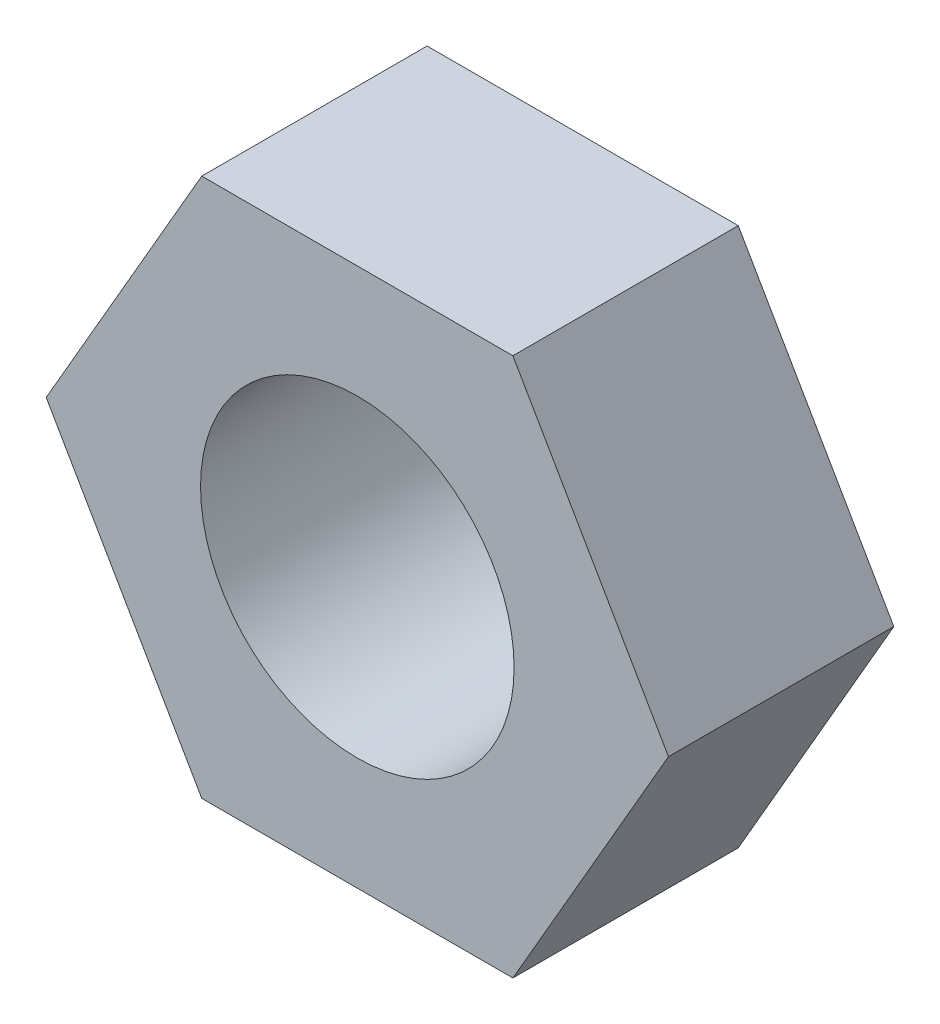
ISO-10303-21;
HEADER;
FILE_DESCRIPTION(('STEP AP214'),'2;1');
FILE_NAME('part.step','',(''),(''),'','','');
FILE_SCHEMA(('AUTOMOTIVE_DESIGN { 1 0 10303 214 1 1 1 1 }'));
ENDSEC;
DATA;
#1=APPLICATION_CONTEXT('core data for automotive mechanical design processes');
#2=APPLICATION_PROTOCOL_DEFINITION('international standard','automotive_design',2000,#1);
#3=PRODUCT_CONTEXT('',#1,'mechanical');
#4=PRODUCT('Part','Part','',(#3));
#5=PRODUCT_RELATED_PRODUCT_CATEGORY('part','',(#4));
#6=PRODUCT_DEFINITION_FORMATION('','',#4);
#7=PRODUCT_DEFINITION_CONTEXT('part definition',#1,'design');
#8=PRODUCT_DEFINITION('design','',#6,#7);
#9=PRODUCT_DEFINITION_SHAPE('','',#8);
#10=(LENGTH_UNIT() NAMED_UNIT(*) SI_UNIT(.MILLI.,.METRE.));
#11=(NAMED_UNIT(*) PLANE_ANGLE_UNIT() SI_UNIT($,.RADIAN.));
#12=(NAMED_UNIT(*) SI_UNIT($,.STERADIAN.) SOLID_ANGLE_UNIT());
#13=UNCERTAINTY_MEASURE_WITH_UNIT(LENGTH_MEASURE(1.E-05),#10,'distance_accuracy_value','');
#14=(GEOMETRIC_REPRESENTATION_CONTEXT(3) GLOBAL_UNCERTAINTY_ASSIGNED_CONTEXT((#13)) GLOBAL_UNIT_ASSIGNED_CONTEXT((#10,
#11,#12)) REPRESENTATION_CONTEXT('',''));
#15=CARTESIAN_POINT('',(0.,0.,0.));
#16=DIRECTION('',(0.,0.,1.));
#17=DIRECTION('',(1.,0.,0.));
#18=AXIS2_PLACEMENT_3D('',#15,#16,#17);
#19=CARTESIAN_POINT('',(0.,0.,2.3));
#20=DIRECTION('',(0.,0.,1.));
#21=DIRECTION('',(1.,0.,0.));
#22=AXIS2_PLACEMENT_3D('',#19,#20,#21);
#23=PLANE('',#22);
#24=DIRECTION('',(-0.5,0.866025403784439,0.));
#25=VECTOR('',#24,1.);
#26=CARTESIAN_POINT('',(3.17542648054294,0.,2.3));
#27=LINE('',#26,#25);
#28=CARTESIAN_POINT('',(3.17542648054294,0.,2.3));
#29=VERTEX_POINT('',#28);
#30=CARTESIAN_POINT('',(1.58771324027147,2.75,2.3));
#31=VERTEX_POINT('',#30);
#32=EDGE_CURVE('E129',#29,#31,#27,.T.);
#33=ORIENTED_EDGE('',*,*,#32,.T.);
#34=DIRECTION('',(-1.,0.,0.));
#35=VECTOR('',#34,1.);
#36=CARTESIAN_POINT('',(1.58771324027147,2.75,2.3));
#37=LINE('',#36,#35);
#38=CARTESIAN_POINT('',(-1.58771324027147,2.75,2.3));
#39=VERTEX_POINT('',#38);
#40=EDGE_CURVE('E87',#31,#39,#37,.T.);
#41=ORIENTED_EDGE('',*,*,#40,.T.);
#42=DIRECTION('',(-0.5,-0.866025403784439,0.));
#43=VECTOR('',#42,1.);
#44=CARTESIAN_POINT('',(-1.58771324027147,2.75,2.3));
#45=LINE('',#44,#43);
#46=CARTESIAN_POINT('',(-3.17542648054294,0.,2.3));
#47=VERTEX_POINT('',#46);
#48=EDGE_CURVE('E100',#39,#47,#45,.T.);
#49=ORIENTED_EDGE('',*,*,#48,.T.);
#50=DIRECTION('',(0.5,-0.866025403784439,0.));
#51=VECTOR('',#50,1.);
#52=CARTESIAN_POINT('',(-3.17542648054294,0.,2.3));
#53=LINE('',#52,#51);
#54=CARTESIAN_POINT('',(-1.58771324027147,-2.75,2.3));
#55=VERTEX_POINT('',#54);
#56=EDGE_CURVE('E94',#47,#55,#53,.T.);
#57=ORIENTED_EDGE('',*,*,#56,.T.);
#58=DIRECTION('',(1.,0.,0.));
#59=VECTOR('',#58,1.);
#60=CARTESIAN_POINT('',(-1.58771324027147,-2.75,2.3));
#61=LINE('',#60,#59);
#62=CARTESIAN_POINT('',(1.58771324027147,-2.75,2.3));
#63=VERTEX_POINT('',#62);
#64=EDGE_CURVE('E98',#55,#63,#61,.T.);
#65=ORIENTED_EDGE('',*,*,#64,.T.);
#66=DIRECTION('',(0.5,0.866025403784439,0.));
#67=VECTOR('',#66,1.);
#68=CARTESIAN_POINT('',(1.58771324027147,-2.75,2.3));
#69=LINE('',#68,#67);
#70=EDGE_CURVE('E50',#63,#29,#69,.T.);
#71=ORIENTED_EDGE('',*,*,#70,.T.);
#72=EDGE_LOOP('',(#33,#41,#49,#57,#65,#71));
#73=FACE_BOUND('',#72,.T.);
#74=CARTESIAN_POINT('',(0.,0.,2.3));
#75=DIRECTION('',(0.,0.,1.));
#76=DIRECTION('',(1.,0.,0.));
#77=AXIS2_PLACEMENT_3D('',#74,#75,#76);
#78=CIRCLE('',#77,1.6);
#79=CARTESIAN_POINT('',(1.6,0.,2.3));
#80=VERTEX_POINT('',#79);
#81=EDGE_CURVE('E122',#80,#80,#78,.T.);
#82=ORIENTED_EDGE('',*,*,#81,.F.);
#83=EDGE_LOOP('',(#82));
#84=FACE_BOUND('',#83,.T.);
#85=ADVANCED_FACE('F33',(#73,#84),#23,.T.);
#86=CARTESIAN_POINT('',(0.,0.,0.));
#87=DIRECTION('',(0.,0.,1.));
#88=DIRECTION('',(1.,0.,0.));
#89=AXIS2_PLACEMENT_3D('',#86,#87,#88);
#90=PLANE('',#89);
#91=DIRECTION('',(-0.5,0.866025403784439,0.));
#92=VECTOR('',#91,1.);
#93=CARTESIAN_POINT('',(3.17542648054294,0.,0.));
#94=LINE('',#93,#92);
#95=CARTESIAN_POINT('',(3.17542648054294,0.,0.));
#96=VERTEX_POINT('',#95);
#97=CARTESIAN_POINT('',(1.58771324027147,2.75,0.));
#98=VERTEX_POINT('',#97);
#99=EDGE_CURVE('E118',#96,#98,#94,.T.);
#100=ORIENTED_EDGE('',*,*,#99,.F.);
#101=DIRECTION('',(0.5,0.866025403784439,0.));
#102=VECTOR('',#101,1.);
#103=CARTESIAN_POINT('',(1.58771324027147,-2.75,0.));
#104=LINE('',#103,#102);
#105=CARTESIAN_POINT('',(1.58771324027147,-2.75,0.));
#106=VERTEX_POINT('',#105);
#107=EDGE_CURVE('E79',#106,#96,#104,.T.);
#108=ORIENTED_EDGE('',*,*,#107,.F.);
#109=DIRECTION('',(1.,0.,0.));
#110=VECTOR('',#109,1.);
#111=CARTESIAN_POINT('',(-1.58771324027147,-2.75,0.));
#112=LINE('',#111,#110);
#113=CARTESIAN_POINT('',(-1.58771324027147,-2.75,0.));
#114=VERTEX_POINT('',#113);
#115=EDGE_CURVE('E73',#114,#106,#112,.T.);
#116=ORIENTED_EDGE('',*,*,#115,.F.);
#117=DIRECTION('',(0.5,-0.866025403784439,0.));
#118=VECTOR('',#117,1.);
#119=CARTESIAN_POINT('',(-3.17542648054294,0.,0.));
#120=LINE('',#119,#118);
#121=CARTESIAN_POINT('',(-3.17542648054294,0.,0.));
#122=VERTEX_POINT('',#121);
#123=EDGE_CURVE('E108',#122,#114,#120,.T.);
#124=ORIENTED_EDGE('',*,*,#123,.F.);
#125=DIRECTION('',(-0.5,-0.866025403784439,0.));
#126=VECTOR('',#125,1.);
#127=CARTESIAN_POINT('',(-1.58771324027147,2.75,0.));
#128=LINE('',#127,#126);
#129=CARTESIAN_POINT('',(-1.58771324027147,2.75,0.));
#130=VERTEX_POINT('',#129);
#131=EDGE_CURVE('E124',#130,#122,#128,.T.);
#132=ORIENTED_EDGE('',*,*,#131,.F.);
#133=DIRECTION('',(-1.,0.,0.));
#134=VECTOR('',#133,1.);
#135=CARTESIAN_POINT('',(1.58771324027147,2.75,0.));
#136=LINE('',#135,#134);
#137=EDGE_CURVE('E121',#98,#130,#136,.T.);
#138=ORIENTED_EDGE('',*,*,#137,.F.);
#139=EDGE_LOOP('',(#100,#108,#116,#124,#132,#138));
#140=FACE_BOUND('',#139,.T.);
#141=CARTESIAN_POINT('',(0.,0.,0.));
#142=DIRECTION('',(0.,0.,1.));
#143=DIRECTION('',(1.,0.,0.));
#144=AXIS2_PLACEMENT_3D('',#141,#142,#143);
#145=CIRCLE('',#144,1.6);
#146=CARTESIAN_POINT('',(1.6,0.,0.));
#147=VERTEX_POINT('',#146);
#148=EDGE_CURVE('E222',#147,#147,#145,.T.);
#149=ORIENTED_EDGE('',*,*,#148,.T.);
#150=EDGE_LOOP('',(#149));
#151=FACE_BOUND('',#150,.T.);
#152=ADVANCED_FACE('F138',(#140,#151),#90,.F.);
#153=CARTESIAN_POINT('',(3.17542648054294,0.,2.3));
#154=DIRECTION('',(-0.866025403784439,-0.5,0.));
#155=DIRECTION('',(0.5,-0.866025403784439,0.));
#156=AXIS2_PLACEMENT_3D('',#153,#154,#155);
#157=PLANE('',#156);
#158=ORIENTED_EDGE('',*,*,#99,.T.);
#159=DIRECTION('',(0.,0.,-1.));
#160=VECTOR('',#159,1.);
#161=CARTESIAN_POINT('',(1.58771324027147,2.75,2.3));
#162=LINE('',#161,#160);
#163=EDGE_CURVE('E11',#31,#98,#162,.T.);
#164=ORIENTED_EDGE('',*,*,#163,.F.);
#165=ORIENTED_EDGE('',*,*,#32,.F.);
#166=DIRECTION('',(0.,0.,-1.));
#167=VECTOR('',#166,1.);
#168=CARTESIAN_POINT('',(3.17542648054294,0.,2.3));
#169=LINE('',#168,#167);
#170=EDGE_CURVE('E114',#29,#96,#169,.T.);
#171=ORIENTED_EDGE('',*,*,#170,.T.);
#172=EDGE_LOOP('',(#158,#164,#165,#171));
#173=FACE_BOUND('',#172,.T.);
#174=ADVANCED_FACE('F35',(#173),#157,.F.);
#175=CARTESIAN_POINT('',(1.58771324027147,2.75,2.3));
#176=DIRECTION('',(0.,-1.,0.));
#177=DIRECTION('',(0.,0.,-1.));
#178=AXIS2_PLACEMENT_3D('',#175,#176,#177);
#179=PLANE('',#178);
#180=ORIENTED_EDGE('',*,*,#137,.T.);
#181=DIRECTION('',(0.,0.,-1.));
#182=VECTOR('',#181,1.);
#183=CARTESIAN_POINT('',(-1.58771324027147,2.75,2.3));
#184=LINE('',#183,#182);
#185=EDGE_CURVE('E42',#39,#130,#184,.T.);
#186=ORIENTED_EDGE('',*,*,#185,.F.);
#187=ORIENTED_EDGE('',*,*,#40,.F.);
#188=ORIENTED_EDGE('',*,*,#163,.T.);
#189=EDGE_LOOP('',(#180,#186,#187,#188));
#190=FACE_BOUND('',#189,.T.);
#191=ADVANCED_FACE('F163',(#190),#179,.F.);
#192=CARTESIAN_POINT('',(-1.58771324027147,2.75,2.3));
#193=DIRECTION('',(0.866025403784439,-0.5,0.));
#194=DIRECTION('',(0.5,0.866025403784439,0.));
#195=AXIS2_PLACEMENT_3D('',#192,#193,#194);
#196=PLANE('',#195);
#197=ORIENTED_EDGE('',*,*,#131,.T.);
#198=DIRECTION('',(0.,0.,-1.));
#199=VECTOR('',#198,1.);
#200=CARTESIAN_POINT('',(-3.17542648054294,0.,2.3));
#201=LINE('',#200,#199);
#202=EDGE_CURVE('E109',#47,#122,#201,.T.);
#203=ORIENTED_EDGE('',*,*,#202,.F.);
#204=ORIENTED_EDGE('',*,*,#48,.F.);
#205=ORIENTED_EDGE('',*,*,#185,.T.);
#206=EDGE_LOOP('',(#197,#203,#204,#205));
#207=FACE_BOUND('',#206,.T.);
#208=ADVANCED_FACE('F135',(#207),#196,.F.);
#209=CARTESIAN_POINT('',(-3.17542648054294,0.,2.3));
#210=DIRECTION('',(0.866025403784439,0.5,0.));
#211=DIRECTION('',(-0.5,0.866025403784439,0.));
#212=AXIS2_PLACEMENT_3D('',#209,#210,#211);
#213=PLANE('',#212);
#214=ORIENTED_EDGE('',*,*,#123,.T.);
#215=DIRECTION('',(0.,0.,-1.));
#216=VECTOR('',#215,1.);
#217=CARTESIAN_POINT('',(-1.58771324027147,-2.75,2.3));
#218=LINE('',#217,#216);
#219=EDGE_CURVE('E105',#55,#114,#218,.T.);
#220=ORIENTED_EDGE('',*,*,#219,.F.);
#221=ORIENTED_EDGE('',*,*,#56,.F.);
#222=ORIENTED_EDGE('',*,*,#202,.T.);
#223=EDGE_LOOP('',(#214,#220,#221,#222));
#224=FACE_BOUND('',#223,.T.);
#225=ADVANCED_FACE('F106',(#224),#213,.F.);
#226=CARTESIAN_POINT('',(-1.58771324027147,-2.75,2.3));
#227=DIRECTION('',(0.,1.,0.));
#228=DIRECTION('',(0.,0.,1.));
#229=AXIS2_PLACEMENT_3D('',#226,#227,#228);
#230=PLANE('',#229);
#231=ORIENTED_EDGE('',*,*,#115,.T.);
#232=DIRECTION('',(0.,0.,-1.));
#233=VECTOR('',#232,1.);
#234=CARTESIAN_POINT('',(1.58771324027147,-2.75,2.3));
#235=LINE('',#234,#233);
#236=EDGE_CURVE('E110',#63,#106,#235,.T.);
#237=ORIENTED_EDGE('',*,*,#236,.F.);
#238=ORIENTED_EDGE('',*,*,#64,.F.);
#239=ORIENTED_EDGE('',*,*,#219,.T.);
#240=EDGE_LOOP('',(#231,#237,#238,#239));
#241=FACE_BOUND('',#240,.T.);
#242=ADVANCED_FACE('F112',(#241),#230,.F.);
#243=CARTESIAN_POINT('',(1.58771324027147,-2.75,2.3));
#244=DIRECTION('',(-0.866025403784439,0.5,0.));
#245=DIRECTION('',(-0.5,-0.866025403784439,0.));
#246=AXIS2_PLACEMENT_3D('',#243,#244,#245);
#247=PLANE('',#246);
#248=ORIENTED_EDGE('',*,*,#107,.T.);
#249=ORIENTED_EDGE('',*,*,#170,.F.);
#250=ORIENTED_EDGE('',*,*,#70,.F.);
#251=ORIENTED_EDGE('',*,*,#236,.T.);
#252=EDGE_LOOP('',(#248,#249,#250,#251));
#253=FACE_BOUND('',#252,.T.);
#254=ADVANCED_FACE('F143',(#253),#247,.F.);
#255=CARTESIAN_POINT('',(0.,0.,2.3));
#256=DIRECTION('',(0.,0.,-1.));
#257=DIRECTION('',(-1.,0.,0.));
#258=AXIS2_PLACEMENT_3D('',#255,#256,#257);
#259=CYLINDRICAL_SURFACE('',#258,1.6);
#260=ORIENTED_EDGE('',*,*,#81,.T.);
#261=EDGE_LOOP('',(#260));
#262=FACE_BOUND('',#261,.T.);
#263=ORIENTED_EDGE('',*,*,#148,.F.);
#264=EDGE_LOOP('',(#263));
#265=FACE_BOUND('',#264,.T.);
#266=ADVANCED_FACE('F145',(#262,#265),#259,.F.);
#267=CLOSED_SHELL('',(#85,#152,#174,#191,#208,#225,#242,#254,#266));
#268=MANIFOLD_SOLID_BREP('B2',#267);
#269=ADVANCED_BREP_SHAPE_REPRESENTATION('',(#18,#268),#14);
#270=SHAPE_DEFINITION_REPRESENTATION(#9,#269);
ENDSEC;
END-ISO-10303-21;
